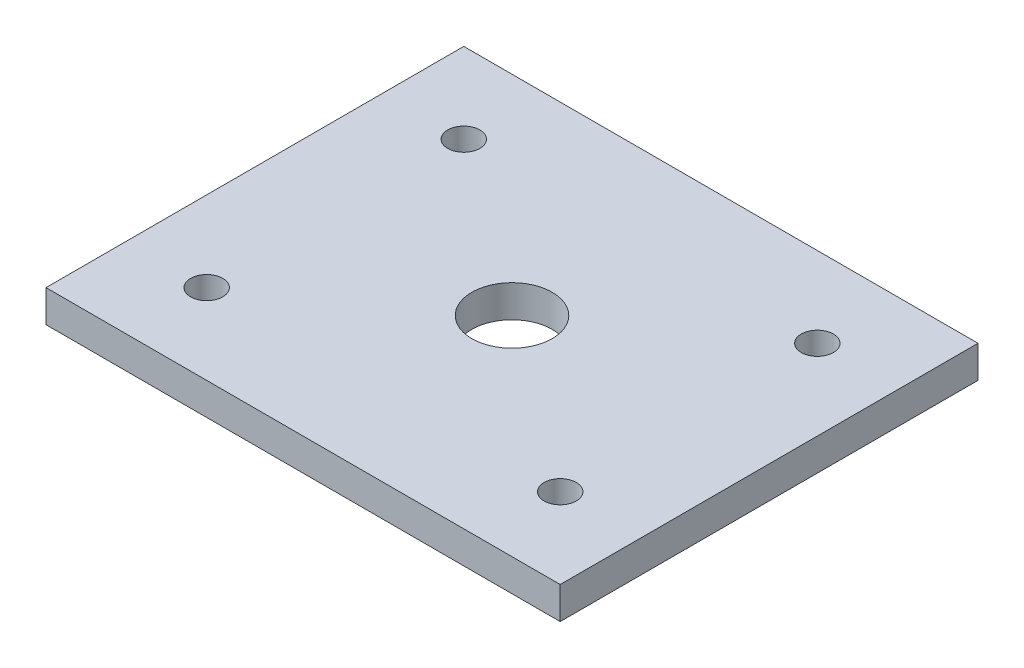
ISO-10303-21;
HEADER;
FILE_DESCRIPTION(('STEP AP214'),'2;1');
FILE_NAME('part.step','',(''),(''),'','','');
FILE_SCHEMA(('AUTOMOTIVE_DESIGN { 1 0 10303 214 1 1 1 1 }'));
ENDSEC;
DATA;
#1=APPLICATION_CONTEXT('core data for automotive mechanical design processes');
#2=APPLICATION_PROTOCOL_DEFINITION('international standard','automotive_design',2000,#1);
#3=PRODUCT_CONTEXT('',#1,'mechanical');
#4=PRODUCT('Part','Part','',(#3));
#5=PRODUCT_RELATED_PRODUCT_CATEGORY('part','',(#4));
#6=PRODUCT_DEFINITION_FORMATION('','',#4);
#7=PRODUCT_DEFINITION_CONTEXT('part definition',#1,'design');
#8=PRODUCT_DEFINITION('design','',#6,#7);
#9=PRODUCT_DEFINITION_SHAPE('','',#8);
#10=(LENGTH_UNIT() NAMED_UNIT(*) SI_UNIT(.MILLI.,.METRE.));
#11=(NAMED_UNIT(*) PLANE_ANGLE_UNIT() SI_UNIT($,.RADIAN.));
#12=(NAMED_UNIT(*) SI_UNIT($,.STERADIAN.) SOLID_ANGLE_UNIT());
#13=UNCERTAINTY_MEASURE_WITH_UNIT(LENGTH_MEASURE(1.E-05),#10,'distance_accuracy_value','');
#14=(GEOMETRIC_REPRESENTATION_CONTEXT(3) GLOBAL_UNCERTAINTY_ASSIGNED_CONTEXT((#13)) GLOBAL_UNIT_ASSIGNED_CONTEXT((#10,
#11,#12)) REPRESENTATION_CONTEXT('',''));
#15=CARTESIAN_POINT('',(0.,0.,0.));
#16=DIRECTION('',(0.,0.,1.));
#17=DIRECTION('',(1.,0.,0.));
#18=AXIS2_PLACEMENT_3D('',#15,#16,#17);
#19=CARTESIAN_POINT('',(0.,4.,0.));
#20=DIRECTION('',(0.,-1.,0.));
#21=DIRECTION('',(0.,0.,-1.));
#22=AXIS2_PLACEMENT_3D('',#19,#20,#21);
#23=PLANE('',#22);
#24=DIRECTION('',(0.,0.,1.));
#25=VECTOR('',#24,1.);
#26=CARTESIAN_POINT('',(-32.,4.,26.));
#27=LINE('',#26,#25);
#28=CARTESIAN_POINT('',(-32.,4.,-26.));
#29=VERTEX_POINT('',#28);
#30=CARTESIAN_POINT('',(-32.,4.,26.));
#31=VERTEX_POINT('',#30);
#32=EDGE_CURVE('E91',#29,#31,#27,.T.);
#33=ORIENTED_EDGE('',*,*,#32,.T.);
#34=DIRECTION('',(1.,0.,0.));
#35=VECTOR('',#34,1.);
#36=CARTESIAN_POINT('',(-32.,4.,26.));
#37=LINE('',#36,#35);
#38=CARTESIAN_POINT('',(32.,4.,26.));
#39=VERTEX_POINT('',#38);
#40=EDGE_CURVE('E86',#31,#39,#37,.T.);
#41=ORIENTED_EDGE('',*,*,#40,.T.);
#42=DIRECTION('',(0.,0.,-1.));
#43=VECTOR('',#42,1.);
#44=CARTESIAN_POINT('',(32.,4.,26.));
#45=LINE('',#44,#43);
#46=CARTESIAN_POINT('',(32.,4.,-26.));
#47=VERTEX_POINT('',#46);
#48=EDGE_CURVE('E87',#39,#47,#45,.T.);
#49=ORIENTED_EDGE('',*,*,#48,.T.);
#50=DIRECTION('',(-1.,0.,0.));
#51=VECTOR('',#50,1.);
#52=CARTESIAN_POINT('',(-32.,4.,-26.));
#53=LINE('',#52,#51);
#54=EDGE_CURVE('E57',#47,#29,#53,.T.);
#55=ORIENTED_EDGE('',*,*,#54,.T.);
#56=EDGE_LOOP('',(#33,#41,#49,#55));
#57=FACE_BOUND('',#56,.T.);
#58=CARTESIAN_POINT('',(0.,4.,0.));
#59=DIRECTION('',(0.,1.,0.));
#60=DIRECTION('',(0.,0.,1.));
#61=AXIS2_PLACEMENT_3D('',#58,#59,#60);
#62=CIRCLE('',#61,5.);
#63=CARTESIAN_POINT('',(0.,4.,5.));
#64=VERTEX_POINT('',#63);
#65=EDGE_CURVE('E106',#64,#64,#62,.T.);
#66=ORIENTED_EDGE('',*,*,#65,.F.);
#67=EDGE_LOOP('',(#66));
#68=FACE_BOUND('',#67,.T.);
#69=CARTESIAN_POINT('',(-22.,4.,16.));
#70=DIRECTION('',(0.,1.,0.));
#71=DIRECTION('',(0.,0.,1.));
#72=AXIS2_PLACEMENT_3D('',#69,#70,#71);
#73=CIRCLE('',#72,2.);
#74=CARTESIAN_POINT('',(-22.,4.,18.));
#75=VERTEX_POINT('',#74);
#76=EDGE_CURVE('E123',#75,#75,#73,.T.);
#77=ORIENTED_EDGE('',*,*,#76,.F.);
#78=EDGE_LOOP('',(#77));
#79=FACE_BOUND('',#78,.T.);
#80=CARTESIAN_POINT('',(22.,4.,16.));
#81=DIRECTION('',(0.,1.,0.));
#82=DIRECTION('',(0.,0.,1.));
#83=AXIS2_PLACEMENT_3D('',#80,#81,#82);
#84=CIRCLE('',#83,2.);
#85=CARTESIAN_POINT('',(22.,4.,18.));
#86=VERTEX_POINT('',#85);
#87=EDGE_CURVE('E130',#86,#86,#84,.T.);
#88=ORIENTED_EDGE('',*,*,#87,.F.);
#89=EDGE_LOOP('',(#88));
#90=FACE_BOUND('',#89,.T.);
#91=CARTESIAN_POINT('',(-22.,4.,-16.));
#92=DIRECTION('',(0.,1.,0.));
#93=DIRECTION('',(0.,0.,1.));
#94=AXIS2_PLACEMENT_3D('',#91,#92,#93);
#95=CIRCLE('',#94,2.);
#96=CARTESIAN_POINT('',(-22.,4.,-14.));
#97=VERTEX_POINT('',#96);
#98=EDGE_CURVE('E133',#97,#97,#95,.T.);
#99=ORIENTED_EDGE('',*,*,#98,.F.);
#100=EDGE_LOOP('',(#99));
#101=FACE_BOUND('',#100,.T.);
#102=CARTESIAN_POINT('',(22.,4.,-16.));
#103=DIRECTION('',(0.,1.,0.));
#104=DIRECTION('',(0.,0.,1.));
#105=AXIS2_PLACEMENT_3D('',#102,#103,#104);
#106=CIRCLE('',#105,2.);
#107=CARTESIAN_POINT('',(22.,4.,-14.));
#108=VERTEX_POINT('',#107);
#109=EDGE_CURVE('E137',#108,#108,#106,.T.);
#110=ORIENTED_EDGE('',*,*,#109,.F.);
#111=EDGE_LOOP('',(#110));
#112=FACE_BOUND('',#111,.T.);
#113=ADVANCED_FACE('F39',(#57,#68,#79,#90,#101,#112),#23,.F.);
#114=CARTESIAN_POINT('',(0.,0.,0.));
#115=DIRECTION('',(0.,-1.,0.));
#116=DIRECTION('',(0.,0.,-1.));
#117=AXIS2_PLACEMENT_3D('',#114,#115,#116);
#118=PLANE('',#117);
#119=CARTESIAN_POINT('',(-22.,0.,-16.));
#120=DIRECTION('',(0.,1.,0.));
#121=DIRECTION('',(0.,0.,1.));
#122=AXIS2_PLACEMENT_3D('',#119,#120,#121);
#123=CIRCLE('',#122,2.);
#124=CARTESIAN_POINT('',(-22.,0.,-14.));
#125=VERTEX_POINT('',#124);
#126=EDGE_CURVE('E136',#125,#125,#123,.T.);
#127=ORIENTED_EDGE('',*,*,#126,.T.);
#128=EDGE_LOOP('',(#127));
#129=FACE_BOUND('',#128,.T.);
#130=CARTESIAN_POINT('',(-22.,0.,16.));
#131=DIRECTION('',(0.,1.,0.));
#132=DIRECTION('',(0.,0.,1.));
#133=AXIS2_PLACEMENT_3D('',#130,#131,#132);
#134=CIRCLE('',#133,2.);
#135=CARTESIAN_POINT('',(-22.,0.,18.));
#136=VERTEX_POINT('',#135);
#137=EDGE_CURVE('E125',#136,#136,#134,.T.);
#138=ORIENTED_EDGE('',*,*,#137,.T.);
#139=EDGE_LOOP('',(#138));
#140=FACE_BOUND('',#139,.T.);
#141=DIRECTION('',(0.,0.,1.));
#142=VECTOR('',#141,1.);
#143=CARTESIAN_POINT('',(-32.,0.,26.));
#144=LINE('',#143,#142);
#145=CARTESIAN_POINT('',(-32.,0.,-26.));
#146=VERTEX_POINT('',#145);
#147=CARTESIAN_POINT('',(-32.,0.,26.));
#148=VERTEX_POINT('',#147);
#149=EDGE_CURVE('E104',#146,#148,#144,.T.);
#150=ORIENTED_EDGE('',*,*,#149,.F.);
#151=DIRECTION('',(-1.,0.,0.));
#152=VECTOR('',#151,1.);
#153=CARTESIAN_POINT('',(-32.,0.,-26.));
#154=LINE('',#153,#152);
#155=CARTESIAN_POINT('',(32.,0.,-26.));
#156=VERTEX_POINT('',#155);
#157=EDGE_CURVE('E80',#156,#146,#154,.T.);
#158=ORIENTED_EDGE('',*,*,#157,.F.);
#159=DIRECTION('',(0.,0.,-1.));
#160=VECTOR('',#159,1.);
#161=CARTESIAN_POINT('',(32.,0.,26.));
#162=LINE('',#161,#160);
#163=CARTESIAN_POINT('',(32.,0.,26.));
#164=VERTEX_POINT('',#163);
#165=EDGE_CURVE('E74',#164,#156,#162,.T.);
#166=ORIENTED_EDGE('',*,*,#165,.F.);
#167=DIRECTION('',(1.,0.,0.));
#168=VECTOR('',#167,1.);
#169=CARTESIAN_POINT('',(-32.,0.,26.));
#170=LINE('',#169,#168);
#171=EDGE_CURVE('E94',#148,#164,#170,.T.);
#172=ORIENTED_EDGE('',*,*,#171,.F.);
#173=EDGE_LOOP('',(#150,#158,#166,#172));
#174=FACE_BOUND('',#173,.T.);
#175=CARTESIAN_POINT('',(0.,0.,0.));
#176=DIRECTION('',(0.,1.,0.));
#177=DIRECTION('',(0.,0.,1.));
#178=AXIS2_PLACEMENT_3D('',#175,#176,#177);
#179=CIRCLE('',#178,5.);
#180=CARTESIAN_POINT('',(0.,0.,5.));
#181=VERTEX_POINT('',#180);
#182=EDGE_CURVE('E119',#181,#181,#179,.T.);
#183=ORIENTED_EDGE('',*,*,#182,.T.);
#184=EDGE_LOOP('',(#183));
#185=FACE_BOUND('',#184,.T.);
#186=CARTESIAN_POINT('',(22.,0.,16.));
#187=DIRECTION('',(0.,1.,0.));
#188=DIRECTION('',(0.,0.,1.));
#189=AXIS2_PLACEMENT_3D('',#186,#187,#188);
#190=CIRCLE('',#189,2.);
#191=CARTESIAN_POINT('',(22.,0.,18.));
#192=VERTEX_POINT('',#191);
#193=EDGE_CURVE('E127',#192,#192,#190,.T.);
#194=ORIENTED_EDGE('',*,*,#193,.T.);
#195=EDGE_LOOP('',(#194));
#196=FACE_BOUND('',#195,.T.);
#197=CARTESIAN_POINT('',(22.,0.,-16.));
#198=DIRECTION('',(0.,1.,0.));
#199=DIRECTION('',(0.,0.,1.));
#200=AXIS2_PLACEMENT_3D('',#197,#198,#199);
#201=CIRCLE('',#200,2.);
#202=CARTESIAN_POINT('',(22.,0.,-14.));
#203=VERTEX_POINT('',#202);
#204=EDGE_CURVE('E145',#203,#203,#201,.T.);
#205=ORIENTED_EDGE('',*,*,#204,.T.);
#206=EDGE_LOOP('',(#205));
#207=FACE_BOUND('',#206,.T.);
#208=ADVANCED_FACE('F114',(#129,#140,#174,#185,#196,#207),#118,.T.);
#209=CARTESIAN_POINT('',(-32.,4.,26.));
#210=DIRECTION('',(1.,0.,0.));
#211=DIRECTION('',(0.,0.,-1.));
#212=AXIS2_PLACEMENT_3D('',#209,#210,#211);
#213=PLANE('',#212);
#214=ORIENTED_EDGE('',*,*,#149,.T.);
#215=DIRECTION('',(0.,-1.,0.));
#216=VECTOR('',#215,1.);
#217=CARTESIAN_POINT('',(-32.,4.,26.));
#218=LINE('',#217,#216);
#219=EDGE_CURVE('E11',#31,#148,#218,.T.);
#220=ORIENTED_EDGE('',*,*,#219,.F.);
#221=ORIENTED_EDGE('',*,*,#32,.F.);
#222=DIRECTION('',(0.,-1.,0.));
#223=VECTOR('',#222,1.);
#224=CARTESIAN_POINT('',(-32.,4.,-26.));
#225=LINE('',#224,#223);
#226=EDGE_CURVE('E98',#29,#146,#225,.T.);
#227=ORIENTED_EDGE('',*,*,#226,.T.);
#228=EDGE_LOOP('',(#214,#220,#221,#227));
#229=FACE_BOUND('',#228,.T.);
#230=ADVANCED_FACE('F41',(#229),#213,.F.);
#231=CARTESIAN_POINT('',(-32.,4.,26.));
#232=DIRECTION('',(0.,0.,-1.));
#233=DIRECTION('',(-1.,0.,0.));
#234=AXIS2_PLACEMENT_3D('',#231,#232,#233);
#235=PLANE('',#234);
#236=ORIENTED_EDGE('',*,*,#171,.T.);
#237=DIRECTION('',(0.,-1.,0.));
#238=VECTOR('',#237,1.);
#239=CARTESIAN_POINT('',(32.,4.,26.));
#240=LINE('',#239,#238);
#241=EDGE_CURVE('E48',#39,#164,#240,.T.);
#242=ORIENTED_EDGE('',*,*,#241,.F.);
#243=ORIENTED_EDGE('',*,*,#40,.F.);
#244=ORIENTED_EDGE('',*,*,#219,.T.);
#245=EDGE_LOOP('',(#236,#242,#243,#244));
#246=FACE_BOUND('',#245,.T.);
#247=ADVANCED_FACE('F92',(#246),#235,.F.);
#248=CARTESIAN_POINT('',(32.,4.,26.));
#249=DIRECTION('',(-1.,0.,0.));
#250=DIRECTION('',(0.,0.,1.));
#251=AXIS2_PLACEMENT_3D('',#248,#249,#250);
#252=PLANE('',#251);
#253=ORIENTED_EDGE('',*,*,#165,.T.);
#254=DIRECTION('',(0.,-1.,0.));
#255=VECTOR('',#254,1.);
#256=CARTESIAN_POINT('',(32.,4.,-26.));
#257=LINE('',#256,#255);
#258=EDGE_CURVE('E96',#47,#156,#257,.T.);
#259=ORIENTED_EDGE('',*,*,#258,.F.);
#260=ORIENTED_EDGE('',*,*,#48,.F.);
#261=ORIENTED_EDGE('',*,*,#241,.T.);
#262=EDGE_LOOP('',(#253,#259,#260,#261));
#263=FACE_BOUND('',#262,.T.);
#264=ADVANCED_FACE('F100',(#263),#252,.F.);
#265=CARTESIAN_POINT('',(-32.,4.,-26.));
#266=DIRECTION('',(0.,0.,1.));
#267=DIRECTION('',(1.,0.,0.));
#268=AXIS2_PLACEMENT_3D('',#265,#266,#267);
#269=PLANE('',#268);
#270=ORIENTED_EDGE('',*,*,#157,.T.);
#271=ORIENTED_EDGE('',*,*,#226,.F.);
#272=ORIENTED_EDGE('',*,*,#54,.F.);
#273=ORIENTED_EDGE('',*,*,#258,.T.);
#274=EDGE_LOOP('',(#270,#271,#272,#273));
#275=FACE_BOUND('',#274,.T.);
#276=ADVANCED_FACE('F112',(#275),#269,.F.);
#277=CARTESIAN_POINT('',(0.,4.,0.));
#278=DIRECTION('',(0.,-1.,0.));
#279=DIRECTION('',(0.,0.,-1.));
#280=AXIS2_PLACEMENT_3D('',#277,#278,#279);
#281=CYLINDRICAL_SURFACE('',#280,5.);
#282=ORIENTED_EDGE('',*,*,#65,.T.);
#283=EDGE_LOOP('',(#282));
#284=FACE_BOUND('',#283,.T.);
#285=ORIENTED_EDGE('',*,*,#182,.F.);
#286=EDGE_LOOP('',(#285));
#287=FACE_BOUND('',#286,.T.);
#288=ADVANCED_FACE('F159',(#284,#287),#281,.F.);
#289=CARTESIAN_POINT('',(-22.,4.,16.));
#290=DIRECTION('',(0.,-1.,0.));
#291=DIRECTION('',(0.,0.,-1.));
#292=AXIS2_PLACEMENT_3D('',#289,#290,#291);
#293=CYLINDRICAL_SURFACE('',#292,2.);
#294=ORIENTED_EDGE('',*,*,#76,.T.);
#295=EDGE_LOOP('',(#294));
#296=FACE_BOUND('',#295,.T.);
#297=ORIENTED_EDGE('',*,*,#137,.F.);
#298=EDGE_LOOP('',(#297));
#299=FACE_BOUND('',#298,.T.);
#300=ADVANCED_FACE('F204',(#296,#299),#293,.F.);
#301=CARTESIAN_POINT('',(22.,4.,16.));
#302=DIRECTION('',(0.,-1.,0.));
#303=DIRECTION('',(0.,0.,-1.));
#304=AXIS2_PLACEMENT_3D('',#301,#302,#303);
#305=CYLINDRICAL_SURFACE('',#304,2.);
#306=ORIENTED_EDGE('',*,*,#87,.T.);
#307=EDGE_LOOP('',(#306));
#308=FACE_BOUND('',#307,.T.);
#309=ORIENTED_EDGE('',*,*,#193,.F.);
#310=EDGE_LOOP('',(#309));
#311=FACE_BOUND('',#310,.T.);
#312=ADVANCED_FACE('F212',(#308,#311),#305,.F.);
#313=CARTESIAN_POINT('',(-22.,4.,-16.));
#314=DIRECTION('',(0.,-1.,0.));
#315=DIRECTION('',(0.,0.,-1.));
#316=AXIS2_PLACEMENT_3D('',#313,#314,#315);
#317=CYLINDRICAL_SURFACE('',#316,2.);
#318=ORIENTED_EDGE('',*,*,#98,.T.);
#319=EDGE_LOOP('',(#318));
#320=FACE_BOUND('',#319,.T.);
#321=ORIENTED_EDGE('',*,*,#126,.F.);
#322=EDGE_LOOP('',(#321));
#323=FACE_BOUND('',#322,.T.);
#324=ADVANCED_FACE('F217',(#320,#323),#317,.F.);
#325=CARTESIAN_POINT('',(22.,4.,-16.));
#326=DIRECTION('',(0.,-1.,0.));
#327=DIRECTION('',(0.,0.,-1.));
#328=AXIS2_PLACEMENT_3D('',#325,#326,#327);
#329=CYLINDRICAL_SURFACE('',#328,2.);
#330=ORIENTED_EDGE('',*,*,#109,.T.);
#331=EDGE_LOOP('',(#330));
#332=FACE_BOUND('',#331,.T.);
#333=ORIENTED_EDGE('',*,*,#204,.F.);
#334=EDGE_LOOP('',(#333));
#335=FACE_BOUND('',#334,.T.);
#336=ADVANCED_FACE('F149',(#332,#335),#329,.F.);
#337=CLOSED_SHELL('',(#113,#208,#230,#247,#264,#276,#288,#300,#312,#324,#336));
#338=MANIFOLD_SOLID_BREP('B2',#337);
#339=ADVANCED_BREP_SHAPE_REPRESENTATION('',(#18,#338),#14);
#340=SHAPE_DEFINITION_REPRESENTATION(#9,#339);
ENDSEC;
END-ISO-10303-21;
